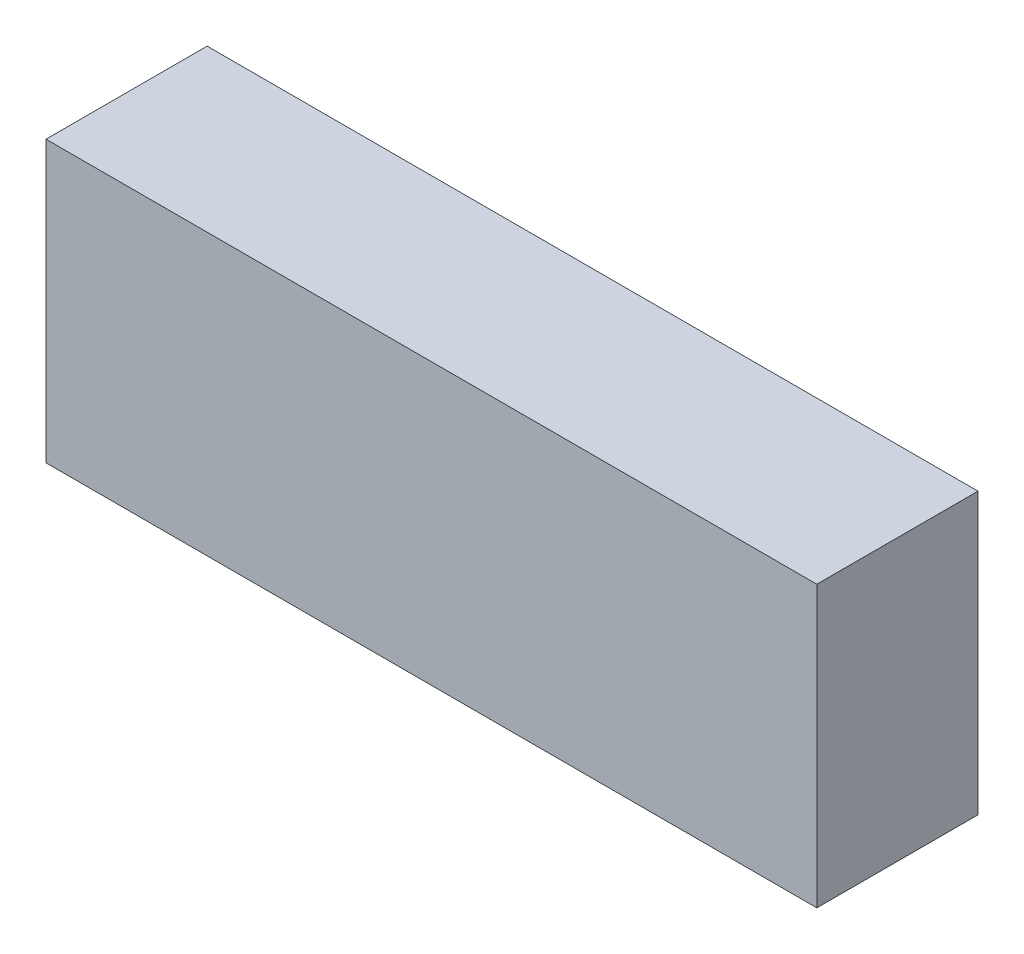
ISO-10303-21;
HEADER;
FILE_DESCRIPTION(('STEP AP214'),'2;1');
FILE_NAME('part.step','',(''),(''),'','','');
FILE_SCHEMA(('AUTOMOTIVE_DESIGN { 1 0 10303 214 1 1 1 1 }'));
ENDSEC;
DATA;
#1=APPLICATION_CONTEXT('core data for automotive mechanical design processes');
#2=APPLICATION_PROTOCOL_DEFINITION('international standard','automotive_design',2000,#1);
#3=PRODUCT_CONTEXT('',#1,'mechanical');
#4=PRODUCT('Part','Part','',(#3));
#5=PRODUCT_RELATED_PRODUCT_CATEGORY('part','',(#4));
#6=PRODUCT_DEFINITION_FORMATION('','',#4);
#7=PRODUCT_DEFINITION_CONTEXT('part definition',#1,'design');
#8=PRODUCT_DEFINITION('design','',#6,#7);
#9=PRODUCT_DEFINITION_SHAPE('','',#8);
#10=(LENGTH_UNIT() NAMED_UNIT(*) SI_UNIT(.MILLI.,.METRE.));
#11=(NAMED_UNIT(*) PLANE_ANGLE_UNIT() SI_UNIT($,.RADIAN.));
#12=(NAMED_UNIT(*) SI_UNIT($,.STERADIAN.) SOLID_ANGLE_UNIT());
#13=UNCERTAINTY_MEASURE_WITH_UNIT(LENGTH_MEASURE(1.E-05),#10,'distance_accuracy_value','');
#14=(GEOMETRIC_REPRESENTATION_CONTEXT(3) GLOBAL_UNCERTAINTY_ASSIGNED_CONTEXT((#13)) GLOBAL_UNIT_ASSIGNED_CONTEXT((#10,
#11,#12)) REPRESENTATION_CONTEXT('',''));
#15=CARTESIAN_POINT('',(0.,0.,0.));
#16=DIRECTION('',(0.,0.,1.));
#17=DIRECTION('',(1.,0.,0.));
#18=AXIS2_PLACEMENT_3D('',#15,#16,#17);
#19=CARTESIAN_POINT('',(-1.397,-1.397,0.635));
#20=DIRECTION('',(0.,0.,1.));
#21=DIRECTION('',(1.,0.,0.));
#22=AXIS2_PLACEMENT_3D('',#19,#20,#21);
#23=PLANE('',#22);
#24=DIRECTION('',(0.,1.,0.));
#25=VECTOR('',#24,1.);
#26=CARTESIAN_POINT('',(1.397,-1.397,0.635));
#27=LINE('',#26,#25);
#28=CARTESIAN_POINT('',(1.397,-0.381,0.635));
#29=VERTEX_POINT('',#28);
#30=CARTESIAN_POINT('',(1.397,-1.397,0.635));
#31=VERTEX_POINT('',#30);
#32=EDGE_CURVE('E76',#29,#31,#27,.F.);
#33=ORIENTED_EDGE('',*,*,#32,.F.);
#34=DIRECTION('',(1.,0.,0.));
#35=VECTOR('',#34,1.);
#36=CARTESIAN_POINT('',(-1.397,-0.381,0.635));
#37=LINE('',#36,#35);
#38=CARTESIAN_POINT('',(-1.397,-0.381,0.635));
#39=VERTEX_POINT('',#38);
#40=EDGE_CURVE('E58',#39,#29,#37,.T.);
#41=ORIENTED_EDGE('',*,*,#40,.F.);
#42=DIRECTION('',(0.,1.,0.));
#43=VECTOR('',#42,1.);
#44=CARTESIAN_POINT('',(-1.397,-1.397,0.635));
#45=LINE('',#44,#43);
#46=CARTESIAN_POINT('',(-1.397,-1.397,0.635));
#47=VERTEX_POINT('',#46);
#48=EDGE_CURVE('E20',#39,#47,#45,.F.);
#49=ORIENTED_EDGE('',*,*,#48,.T.);
#50=DIRECTION('',(1.,0.,0.));
#51=VECTOR('',#50,1.);
#52=CARTESIAN_POINT('',(-1.397,-1.397,0.635));
#53=LINE('',#52,#51);
#54=EDGE_CURVE('E55',#47,#31,#53,.T.);
#55=ORIENTED_EDGE('',*,*,#54,.T.);
#56=EDGE_LOOP('',(#33,#41,#49,#55));
#57=FACE_BOUND('',#56,.T.);
#58=ADVANCED_FACE('F17',(#57),#23,.T.);
#59=CARTESIAN_POINT('',(-1.397,-1.397,0.0508));
#60=DIRECTION('',(1.,0.,0.));
#61=DIRECTION('',(0.,0.,-1.));
#62=AXIS2_PLACEMENT_3D('',#59,#60,#61);
#63=PLANE('',#62);
#64=DIRECTION('',(0.,0.,1.));
#65=VECTOR('',#64,1.);
#66=CARTESIAN_POINT('',(-1.397,-0.381,0.0508));
#67=LINE('',#66,#65);
#68=CARTESIAN_POINT('',(-1.397,-0.381,0.0508));
#69=VERTEX_POINT('',#68);
#70=EDGE_CURVE('E78',#69,#39,#67,.T.);
#71=ORIENTED_EDGE('',*,*,#70,.F.);
#72=DIRECTION('',(0.,1.,0.));
#73=VECTOR('',#72,1.);
#74=CARTESIAN_POINT('',(-1.397,-1.397,0.0508));
#75=LINE('',#74,#73);
#76=CARTESIAN_POINT('',(-1.397,-1.397,0.0508));
#77=VERTEX_POINT('',#76);
#78=EDGE_CURVE('E73',#69,#77,#75,.F.);
#79=ORIENTED_EDGE('',*,*,#78,.T.);
#80=DIRECTION('',(0.,0.,1.));
#81=VECTOR('',#80,1.);
#82=CARTESIAN_POINT('',(-1.397,-1.397,0.0508));
#83=LINE('',#82,#81);
#84=EDGE_CURVE('E63',#77,#47,#83,.T.);
#85=ORIENTED_EDGE('',*,*,#84,.T.);
#86=ORIENTED_EDGE('',*,*,#48,.F.);
#87=EDGE_LOOP('',(#71,#79,#85,#86));
#88=FACE_BOUND('',#87,.T.);
#89=ADVANCED_FACE('F72',(#88),#63,.F.);
#90=CARTESIAN_POINT('',(-1.397,-1.397,0.0508));
#91=DIRECTION('',(0.,1.,0.));
#92=DIRECTION('',(0.,0.,1.));
#93=AXIS2_PLACEMENT_3D('',#90,#91,#92);
#94=PLANE('',#93);
#95=ORIENTED_EDGE('',*,*,#54,.F.);
#96=ORIENTED_EDGE('',*,*,#84,.F.);
#97=DIRECTION('',(1.,0.,0.));
#98=VECTOR('',#97,1.);
#99=CARTESIAN_POINT('',(-1.397,-1.397,0.0508));
#100=LINE('',#99,#98);
#101=CARTESIAN_POINT('',(1.397,-1.397,0.0508));
#102=VERTEX_POINT('',#101);
#103=EDGE_CURVE('E83',#77,#102,#100,.T.);
#104=ORIENTED_EDGE('',*,*,#103,.T.);
#105=DIRECTION('',(0.,0.,-1.));
#106=VECTOR('',#105,1.);
#107=CARTESIAN_POINT('',(1.397,-1.397,0.0508));
#108=LINE('',#107,#106);
#109=EDGE_CURVE('E69',#31,#102,#108,.T.);
#110=ORIENTED_EDGE('',*,*,#109,.F.);
#111=EDGE_LOOP('',(#95,#96,#104,#110));
#112=FACE_BOUND('',#111,.T.);
#113=ADVANCED_FACE('F66',(#112),#94,.F.);
#114=CARTESIAN_POINT('',(1.397,-1.397,0.0508));
#115=DIRECTION('',(1.,0.,0.));
#116=DIRECTION('',(0.,0.,-1.));
#117=AXIS2_PLACEMENT_3D('',#114,#115,#116);
#118=PLANE('',#117);
#119=DIRECTION('',(0.,0.,1.));
#120=VECTOR('',#119,1.);
#121=CARTESIAN_POINT('',(1.397,-0.381,0.0508));
#122=LINE('',#121,#120);
#123=CARTESIAN_POINT('',(1.397,-0.381,0.0508));
#124=VERTEX_POINT('',#123);
#125=EDGE_CURVE('E34',#29,#124,#122,.F.);
#126=ORIENTED_EDGE('',*,*,#125,.F.);
#127=ORIENTED_EDGE('',*,*,#32,.T.);
#128=ORIENTED_EDGE('',*,*,#109,.T.);
#129=DIRECTION('',(0.,1.,0.));
#130=VECTOR('',#129,1.);
#131=CARTESIAN_POINT('',(1.397,-1.397,0.0508));
#132=LINE('',#131,#130);
#133=EDGE_CURVE('E26',#102,#124,#132,.T.);
#134=ORIENTED_EDGE('',*,*,#133,.T.);
#135=EDGE_LOOP('',(#126,#127,#128,#134));
#136=FACE_BOUND('',#135,.T.);
#137=ADVANCED_FACE('F88',(#136),#118,.T.);
#138=CARTESIAN_POINT('',(-1.397,-0.381,0.0508));
#139=DIRECTION('',(0.,1.,0.));
#140=DIRECTION('',(0.,0.,1.));
#141=AXIS2_PLACEMENT_3D('',#138,#139,#140);
#142=PLANE('',#141);
#143=ORIENTED_EDGE('',*,*,#40,.T.);
#144=ORIENTED_EDGE('',*,*,#125,.T.);
#145=DIRECTION('',(1.,0.,0.));
#146=VECTOR('',#145,1.);
#147=CARTESIAN_POINT('',(-1.397,-0.381,0.0508));
#148=LINE('',#147,#146);
#149=EDGE_CURVE('E11',#124,#69,#148,.F.);
#150=ORIENTED_EDGE('',*,*,#149,.T.);
#151=ORIENTED_EDGE('',*,*,#70,.T.);
#152=EDGE_LOOP('',(#143,#144,#150,#151));
#153=FACE_BOUND('',#152,.T.);
#154=ADVANCED_FACE('F91',(#153),#142,.T.);
#155=CARTESIAN_POINT('',(-1.397,-1.397,0.0508));
#156=DIRECTION('',(0.,0.,1.));
#157=DIRECTION('',(1.,0.,0.));
#158=AXIS2_PLACEMENT_3D('',#155,#156,#157);
#159=PLANE('',#158);
#160=ORIENTED_EDGE('',*,*,#133,.F.);
#161=ORIENTED_EDGE('',*,*,#103,.F.);
#162=ORIENTED_EDGE('',*,*,#78,.F.);
#163=ORIENTED_EDGE('',*,*,#149,.F.);
#164=EDGE_LOOP('',(#160,#161,#162,#163));
#165=FACE_BOUND('',#164,.T.);
#166=ADVANCED_FACE('F90',(#165),#159,.F.);
#167=CLOSED_SHELL('',(#58,#89,#113,#137,#154,#166));
#168=MANIFOLD_SOLID_BREP('B1',#167);
#169=ADVANCED_BREP_SHAPE_REPRESENTATION('',(#18,#168),#14);
#170=SHAPE_DEFINITION_REPRESENTATION(#9,#169);
ENDSEC;
END-ISO-10303-21;
